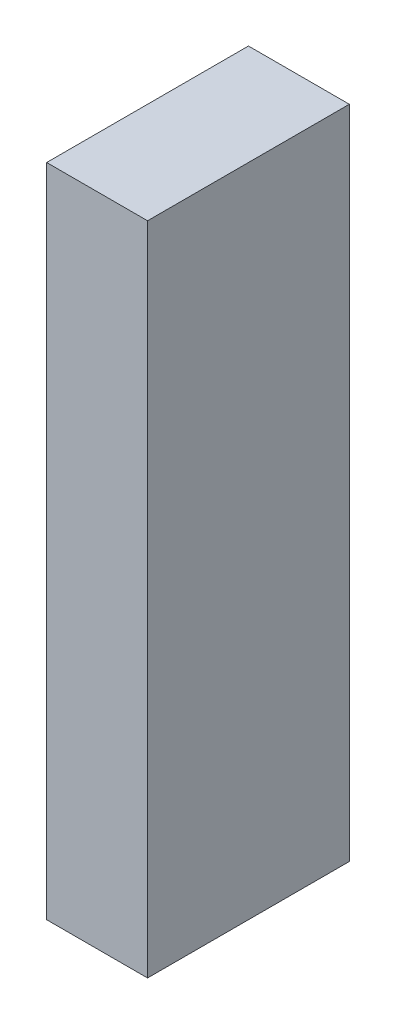
ISO-10303-21;
HEADER;
FILE_DESCRIPTION(('STEP AP214'),'2;1');
FILE_NAME('part.step','',(''),(''),'','','');
FILE_SCHEMA(('AUTOMOTIVE_DESIGN { 1 0 10303 214 1 1 1 1 }'));
ENDSEC;
DATA;
#1=APPLICATION_CONTEXT('core data for automotive mechanical design processes');
#2=APPLICATION_PROTOCOL_DEFINITION('international standard','automotive_design',2000,#1);
#3=PRODUCT_CONTEXT('',#1,'mechanical');
#4=PRODUCT('Part','Part','',(#3));
#5=PRODUCT_RELATED_PRODUCT_CATEGORY('part','',(#4));
#6=PRODUCT_DEFINITION_FORMATION('','',#4);
#7=PRODUCT_DEFINITION_CONTEXT('part definition',#1,'design');
#8=PRODUCT_DEFINITION('design','',#6,#7);
#9=PRODUCT_DEFINITION_SHAPE('','',#8);
#10=(LENGTH_UNIT() NAMED_UNIT(*) SI_UNIT(.MILLI.,.METRE.));
#11=(NAMED_UNIT(*) PLANE_ANGLE_UNIT() SI_UNIT($,.RADIAN.));
#12=(NAMED_UNIT(*) SI_UNIT($,.STERADIAN.) SOLID_ANGLE_UNIT());
#13=UNCERTAINTY_MEASURE_WITH_UNIT(LENGTH_MEASURE(1.E-05),#10,'distance_accuracy_value','');
#14=(GEOMETRIC_REPRESENTATION_CONTEXT(3) GLOBAL_UNCERTAINTY_ASSIGNED_CONTEXT((#13)) GLOBAL_UNIT_ASSIGNED_CONTEXT((#10,
#11,#12)) REPRESENTATION_CONTEXT('',''));
#15=CARTESIAN_POINT('',(0.,0.,0.));
#16=DIRECTION('',(0.,0.,1.));
#17=DIRECTION('',(1.,0.,0.));
#18=AXIS2_PLACEMENT_3D('',#15,#16,#17);
#19=CARTESIAN_POINT('',(0.,330.2,0.));
#20=DIRECTION('',(1.,0.,0.));
#21=DIRECTION('',(0.,0.,-1.));
#22=AXIS2_PLACEMENT_3D('',#19,#20,#21);
#23=PLANE('',#22);
#24=DIRECTION('',(0.,0.,1.));
#25=VECTOR('',#24,1.);
#26=CARTESIAN_POINT('',(0.,0.,0.));
#27=LINE('',#26,#25);
#28=CARTESIAN_POINT('',(0.,0.,-101.6));
#29=VERTEX_POINT('',#28);
#30=CARTESIAN_POINT('',(0.,0.,0.));
#31=VERTEX_POINT('',#30);
#32=EDGE_CURVE('E107',#29,#31,#27,.T.);
#33=ORIENTED_EDGE('',*,*,#32,.T.);
#34=DIRECTION('',(0.,-1.,0.));
#35=VECTOR('',#34,1.);
#36=CARTESIAN_POINT('',(0.,330.2,0.));
#37=LINE('',#36,#35);
#38=CARTESIAN_POINT('',(0.,330.2,0.));
#39=VERTEX_POINT('',#38);
#40=EDGE_CURVE('E11',#39,#31,#37,.T.);
#41=ORIENTED_EDGE('',*,*,#40,.F.);
#42=DIRECTION('',(0.,0.,1.));
#43=VECTOR('',#42,1.);
#44=CARTESIAN_POINT('',(0.,330.2,0.));
#45=LINE('',#44,#43);
#46=CARTESIAN_POINT('',(0.,330.2,-101.6));
#47=VERTEX_POINT('',#46);
#48=EDGE_CURVE('E91',#47,#39,#45,.T.);
#49=ORIENTED_EDGE('',*,*,#48,.F.);
#50=DIRECTION('',(0.,-1.,0.));
#51=VECTOR('',#50,1.);
#52=CARTESIAN_POINT('',(0.,330.2,-101.6));
#53=LINE('',#52,#51);
#54=EDGE_CURVE('E103',#47,#29,#53,.T.);
#55=ORIENTED_EDGE('',*,*,#54,.T.);
#56=EDGE_LOOP('',(#33,#41,#49,#55));
#57=FACE_BOUND('',#56,.T.);
#58=ADVANCED_FACE('F39',(#57),#23,.F.);
#59=CARTESIAN_POINT('',(0.,330.2,0.));
#60=DIRECTION('',(0.,0.,-1.));
#61=DIRECTION('',(-1.,0.,0.));
#62=AXIS2_PLACEMENT_3D('',#59,#60,#61);
#63=PLANE('',#62);
#64=DIRECTION('',(1.,0.,0.));
#65=VECTOR('',#64,1.);
#66=CARTESIAN_POINT('',(0.,0.,0.));
#67=LINE('',#66,#65);
#68=CARTESIAN_POINT('',(50.8,0.,0.));
#69=VERTEX_POINT('',#68);
#70=EDGE_CURVE('E96',#31,#69,#67,.T.);
#71=ORIENTED_EDGE('',*,*,#70,.T.);
#72=DIRECTION('',(0.,-1.,0.));
#73=VECTOR('',#72,1.);
#74=CARTESIAN_POINT('',(50.8,330.2,0.));
#75=LINE('',#74,#73);
#76=CARTESIAN_POINT('',(50.8,330.2,0.));
#77=VERTEX_POINT('',#76);
#78=EDGE_CURVE('E48',#77,#69,#75,.T.);
#79=ORIENTED_EDGE('',*,*,#78,.F.);
#80=DIRECTION('',(1.,0.,0.));
#81=VECTOR('',#80,1.);
#82=CARTESIAN_POINT('',(0.,330.2,0.));
#83=LINE('',#82,#81);
#84=EDGE_CURVE('E86',#39,#77,#83,.T.);
#85=ORIENTED_EDGE('',*,*,#84,.F.);
#86=ORIENTED_EDGE('',*,*,#40,.T.);
#87=EDGE_LOOP('',(#71,#79,#85,#86));
#88=FACE_BOUND('',#87,.T.);
#89=ADVANCED_FACE('F95',(#88),#63,.F.);
#90=CARTESIAN_POINT('',(50.8,330.2,0.));
#91=DIRECTION('',(-1.,0.,0.));
#92=DIRECTION('',(0.,0.,1.));
#93=AXIS2_PLACEMENT_3D('',#90,#91,#92);
#94=PLANE('',#93);
#95=DIRECTION('',(0.,0.,-1.));
#96=VECTOR('',#95,1.);
#97=CARTESIAN_POINT('',(50.8,0.,0.));
#98=LINE('',#97,#96);
#99=CARTESIAN_POINT('',(50.8,0.,-101.6));
#100=VERTEX_POINT('',#99);
#101=EDGE_CURVE('E73',#69,#100,#98,.T.);
#102=ORIENTED_EDGE('',*,*,#101,.T.);
#103=DIRECTION('',(0.,-1.,0.));
#104=VECTOR('',#103,1.);
#105=CARTESIAN_POINT('',(50.8,330.2,-101.6));
#106=LINE('',#105,#104);
#107=CARTESIAN_POINT('',(50.8,330.2,-101.6));
#108=VERTEX_POINT('',#107);
#109=EDGE_CURVE('E98',#108,#100,#106,.T.);
#110=ORIENTED_EDGE('',*,*,#109,.F.);
#111=DIRECTION('',(0.,0.,-1.));
#112=VECTOR('',#111,1.);
#113=CARTESIAN_POINT('',(50.8,330.2,0.));
#114=LINE('',#113,#112);
#115=EDGE_CURVE('E89',#77,#108,#114,.T.);
#116=ORIENTED_EDGE('',*,*,#115,.F.);
#117=ORIENTED_EDGE('',*,*,#78,.T.);
#118=EDGE_LOOP('',(#102,#110,#116,#117));
#119=FACE_BOUND('',#118,.T.);
#120=ADVANCED_FACE('F99',(#119),#94,.F.);
#121=CARTESIAN_POINT('',(0.,330.2,-101.6));
#122=DIRECTION('',(0.,0.,1.));
#123=DIRECTION('',(1.,0.,0.));
#124=AXIS2_PLACEMENT_3D('',#121,#122,#123);
#125=PLANE('',#124);
#126=DIRECTION('',(-1.,0.,0.));
#127=VECTOR('',#126,1.);
#128=CARTESIAN_POINT('',(0.,0.,-101.6));
#129=LINE('',#128,#127);
#130=EDGE_CURVE('E79',#100,#29,#129,.T.);
#131=ORIENTED_EDGE('',*,*,#130,.T.);
#132=ORIENTED_EDGE('',*,*,#54,.F.);
#133=DIRECTION('',(-1.,0.,0.));
#134=VECTOR('',#133,1.);
#135=CARTESIAN_POINT('',(0.,330.2,-101.6));
#136=LINE('',#135,#134);
#137=EDGE_CURVE('E56',#108,#47,#136,.T.);
#138=ORIENTED_EDGE('',*,*,#137,.F.);
#139=ORIENTED_EDGE('',*,*,#109,.T.);
#140=EDGE_LOOP('',(#131,#132,#138,#139));
#141=FACE_BOUND('',#140,.T.);
#142=ADVANCED_FACE('F120',(#141),#125,.F.);
#143=CARTESIAN_POINT('',(0.,330.2,0.));
#144=DIRECTION('',(0.,-1.,0.));
#145=DIRECTION('',(0.,0.,-1.));
#146=AXIS2_PLACEMENT_3D('',#143,#144,#145);
#147=PLANE('',#146);
#148=ORIENTED_EDGE('',*,*,#48,.T.);
#149=ORIENTED_EDGE('',*,*,#84,.T.);
#150=ORIENTED_EDGE('',*,*,#115,.T.);
#151=ORIENTED_EDGE('',*,*,#137,.T.);
#152=EDGE_LOOP('',(#148,#149,#150,#151));
#153=FACE_BOUND('',#152,.T.);
#154=ADVANCED_FACE('F87',(#153),#147,.F.);
#155=CARTESIAN_POINT('',(0.,0.,0.));
#156=DIRECTION('',(0.,-1.,0.));
#157=DIRECTION('',(0.,0.,-1.));
#158=AXIS2_PLACEMENT_3D('',#155,#156,#157);
#159=PLANE('',#158);
#160=ORIENTED_EDGE('',*,*,#32,.F.);
#161=ORIENTED_EDGE('',*,*,#130,.F.);
#162=ORIENTED_EDGE('',*,*,#101,.F.);
#163=ORIENTED_EDGE('',*,*,#70,.F.);
#164=EDGE_LOOP('',(#160,#161,#162,#163));
#165=FACE_BOUND('',#164,.T.);
#166=ADVANCED_FACE('F123',(#165),#159,.T.);
#167=CLOSED_SHELL('',(#58,#89,#120,#142,#154,#166));
#168=MANIFOLD_SOLID_BREP('B2',#167);
#169=ADVANCED_BREP_SHAPE_REPRESENTATION('',(#18,#168),#14);
#170=SHAPE_DEFINITION_REPRESENTATION(#9,#169);
ENDSEC;
END-ISO-10303-21;
